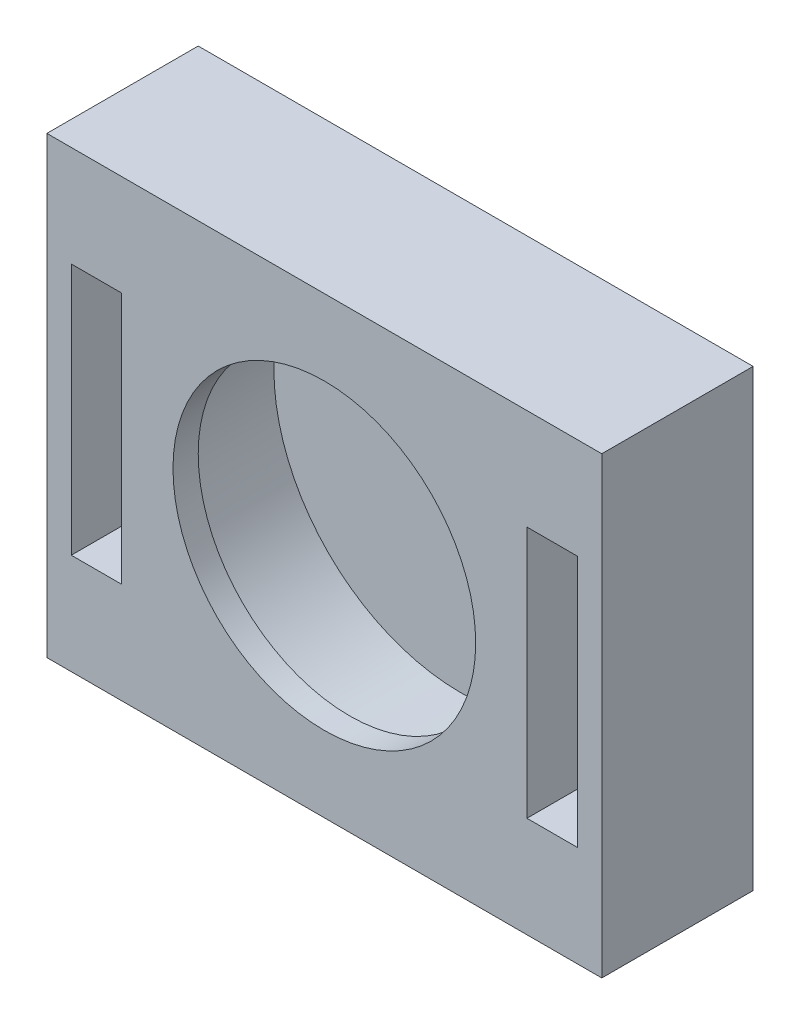
ISO-10303-21;
HEADER;
FILE_DESCRIPTION(('STEP AP214'),'2;1');
FILE_NAME('part.step','',(''),(''),'','','');
FILE_SCHEMA(('AUTOMOTIVE_DESIGN { 1 0 10303 214 1 1 1 1 }'));
ENDSEC;
DATA;
#1=APPLICATION_CONTEXT('core data for automotive mechanical design processes');
#2=APPLICATION_PROTOCOL_DEFINITION('international standard','automotive_design',2000,#1);
#3=PRODUCT_CONTEXT('',#1,'mechanical');
#4=PRODUCT('Part','Part','',(#3));
#5=PRODUCT_RELATED_PRODUCT_CATEGORY('part','',(#4));
#6=PRODUCT_DEFINITION_FORMATION('','',#4);
#7=PRODUCT_DEFINITION_CONTEXT('part definition',#1,'design');
#8=PRODUCT_DEFINITION('design','',#6,#7);
#9=PRODUCT_DEFINITION_SHAPE('','',#8);
#10=(LENGTH_UNIT() NAMED_UNIT(*) SI_UNIT(.MILLI.,.METRE.));
#11=(NAMED_UNIT(*) PLANE_ANGLE_UNIT() SI_UNIT($,.RADIAN.));
#12=(NAMED_UNIT(*) SI_UNIT($,.STERADIAN.) SOLID_ANGLE_UNIT());
#13=UNCERTAINTY_MEASURE_WITH_UNIT(LENGTH_MEASURE(1.E-05),#10,'distance_accuracy_value','');
#14=(GEOMETRIC_REPRESENTATION_CONTEXT(3) GLOBAL_UNCERTAINTY_ASSIGNED_CONTEXT((#13)) GLOBAL_UNIT_ASSIGNED_CONTEXT((#10,
#11,#12)) REPRESENTATION_CONTEXT('',''));
#15=CARTESIAN_POINT('',(0.,0.,0.));
#16=DIRECTION('',(0.,0.,1.));
#17=DIRECTION('',(1.,0.,0.));
#18=AXIS2_PLACEMENT_3D('',#15,#16,#17);
#19=CARTESIAN_POINT('',(13.97,-11.43,6.35));
#20=DIRECTION('',(-1.,0.,0.));
#21=DIRECTION('',(0.,0.,1.));
#22=AXIS2_PLACEMENT_3D('',#19,#20,#21);
#23=PLANE('',#22);
#24=DIRECTION('',(0.,1.,0.));
#25=VECTOR('',#24,1.);
#26=CARTESIAN_POINT('',(13.97,-11.43,0.));
#27=LINE('',#26,#25);
#28=CARTESIAN_POINT('',(13.97,-11.43,0.));
#29=VERTEX_POINT('',#28);
#30=CARTESIAN_POINT('',(13.97,11.43,0.));
#31=VERTEX_POINT('',#30);
#32=EDGE_CURVE('E211',#29,#31,#27,.T.);
#33=ORIENTED_EDGE('',*,*,#32,.T.);
#34=DIRECTION('',(0.,0.,-1.));
#35=VECTOR('',#34,1.);
#36=CARTESIAN_POINT('',(13.97,11.43,6.35));
#37=LINE('',#36,#35);
#38=CARTESIAN_POINT('',(13.97,11.43,7.62));
#39=VERTEX_POINT('',#38);
#40=EDGE_CURVE('E11',#39,#31,#37,.T.);
#41=ORIENTED_EDGE('',*,*,#40,.F.);
#42=DIRECTION('',(0.,1.,0.));
#43=VECTOR('',#42,1.);
#44=CARTESIAN_POINT('',(13.97,11.43,7.62));
#45=LINE('',#44,#43);
#46=CARTESIAN_POINT('',(13.97,-11.43,7.62));
#47=VERTEX_POINT('',#46);
#48=EDGE_CURVE('E201',#47,#39,#45,.T.);
#49=ORIENTED_EDGE('',*,*,#48,.F.);
#50=DIRECTION('',(0.,0.,-1.));
#51=VECTOR('',#50,1.);
#52=CARTESIAN_POINT('',(13.97,-11.43,6.35));
#53=LINE('',#52,#51);
#54=EDGE_CURVE('E222',#47,#29,#53,.T.);
#55=ORIENTED_EDGE('',*,*,#54,.T.);
#56=EDGE_LOOP('',(#33,#41,#49,#55));
#57=FACE_BOUND('',#56,.T.);
#58=ADVANCED_FACE('F33',(#57),#23,.F.);
#59=CARTESIAN_POINT('',(-13.97,11.43,6.35));
#60=DIRECTION('',(0.,-1.,0.));
#61=DIRECTION('',(0.,0.,-1.));
#62=AXIS2_PLACEMENT_3D('',#59,#60,#61);
#63=PLANE('',#62);
#64=DIRECTION('',(-1.,0.,0.));
#65=VECTOR('',#64,1.);
#66=CARTESIAN_POINT('',(-13.97,11.43,0.));
#67=LINE('',#66,#65);
#68=CARTESIAN_POINT('',(-13.97,11.43,0.));
#69=VERTEX_POINT('',#68);
#70=EDGE_CURVE('E216',#31,#69,#67,.T.);
#71=ORIENTED_EDGE('',*,*,#70,.T.);
#72=DIRECTION('',(0.,0.,-1.));
#73=VECTOR('',#72,1.);
#74=CARTESIAN_POINT('',(-13.97,11.43,6.35));
#75=LINE('',#74,#73);
#76=CARTESIAN_POINT('',(-13.97,11.43,7.62));
#77=VERTEX_POINT('',#76);
#78=EDGE_CURVE('E40',#77,#69,#75,.T.);
#79=ORIENTED_EDGE('',*,*,#78,.F.);
#80=DIRECTION('',(-1.,0.,0.));
#81=VECTOR('',#80,1.);
#82=CARTESIAN_POINT('',(-13.97,11.43,7.62));
#83=LINE('',#82,#81);
#84=EDGE_CURVE('E204',#39,#77,#83,.T.);
#85=ORIENTED_EDGE('',*,*,#84,.F.);
#86=ORIENTED_EDGE('',*,*,#40,.T.);
#87=EDGE_LOOP('',(#71,#79,#85,#86));
#88=FACE_BOUND('',#87,.T.);
#89=ADVANCED_FACE('F245',(#88),#63,.F.);
#90=CARTESIAN_POINT('',(-13.97,-11.43,6.35));
#91=DIRECTION('',(1.,0.,0.));
#92=DIRECTION('',(0.,0.,-1.));
#93=AXIS2_PLACEMENT_3D('',#90,#91,#92);
#94=PLANE('',#93);
#95=DIRECTION('',(0.,-1.,0.));
#96=VECTOR('',#95,1.);
#97=CARTESIAN_POINT('',(-13.97,-11.43,0.));
#98=LINE('',#97,#96);
#99=CARTESIAN_POINT('',(-13.97,-11.43,0.));
#100=VERTEX_POINT('',#99);
#101=EDGE_CURVE('E218',#69,#100,#98,.T.);
#102=ORIENTED_EDGE('',*,*,#101,.T.);
#103=DIRECTION('',(0.,0.,-1.));
#104=VECTOR('',#103,1.);
#105=CARTESIAN_POINT('',(-13.97,-11.43,6.35));
#106=LINE('',#105,#104);
#107=CARTESIAN_POINT('',(-13.97,-11.43,7.62));
#108=VERTEX_POINT('',#107);
#109=EDGE_CURVE('E225',#108,#100,#106,.T.);
#110=ORIENTED_EDGE('',*,*,#109,.F.);
#111=DIRECTION('',(0.,-1.,0.));
#112=VECTOR('',#111,1.);
#113=CARTESIAN_POINT('',(-13.97,11.43,7.62));
#114=LINE('',#113,#112);
#115=EDGE_CURVE('E193',#77,#108,#114,.T.);
#116=ORIENTED_EDGE('',*,*,#115,.F.);
#117=ORIENTED_EDGE('',*,*,#78,.T.);
#118=EDGE_LOOP('',(#102,#110,#116,#117));
#119=FACE_BOUND('',#118,.T.);
#120=ADVANCED_FACE('F231',(#119),#94,.F.);
#121=CARTESIAN_POINT('',(-13.97,-11.43,6.35));
#122=DIRECTION('',(0.,1.,0.));
#123=DIRECTION('',(0.,0.,1.));
#124=AXIS2_PLACEMENT_3D('',#121,#122,#123);
#125=PLANE('',#124);
#126=DIRECTION('',(1.,0.,0.));
#127=VECTOR('',#126,1.);
#128=CARTESIAN_POINT('',(-13.97,-11.43,0.));
#129=LINE('',#128,#127);
#130=EDGE_CURVE('E220',#100,#29,#129,.T.);
#131=ORIENTED_EDGE('',*,*,#130,.T.);
#132=ORIENTED_EDGE('',*,*,#54,.F.);
#133=DIRECTION('',(1.,0.,0.));
#134=VECTOR('',#133,1.);
#135=CARTESIAN_POINT('',(-13.97,-11.43,7.62));
#136=LINE('',#135,#134);
#137=EDGE_CURVE('E198',#108,#47,#136,.T.);
#138=ORIENTED_EDGE('',*,*,#137,.F.);
#139=ORIENTED_EDGE('',*,*,#109,.T.);
#140=EDGE_LOOP('',(#131,#132,#138,#139));
#141=FACE_BOUND('',#140,.T.);
#142=ADVANCED_FACE('F238',(#141),#125,.F.);
#143=CARTESIAN_POINT('',(0.,0.,0.));
#144=DIRECTION('',(0.,0.,-1.));
#145=DIRECTION('',(-1.,0.,0.));
#146=AXIS2_PLACEMENT_3D('',#143,#144,#145);
#147=PLANE('',#146);
#148=DIRECTION('',(1.,0.,0.));
#149=VECTOR('',#148,1.);
#150=CARTESIAN_POINT('',(12.7406692898048,-6.35,0.));
#151=LINE('',#150,#149);
#152=CARTESIAN_POINT('',(10.2006692898048,-6.35,0.));
#153=VERTEX_POINT('',#152);
#154=CARTESIAN_POINT('',(12.7406692898048,-6.35,0.));
#155=VERTEX_POINT('',#154);
#156=EDGE_CURVE('E134',#153,#155,#151,.T.);
#157=ORIENTED_EDGE('',*,*,#156,.T.);
#158=DIRECTION('',(0.,1.,0.));
#159=VECTOR('',#158,1.);
#160=CARTESIAN_POINT('',(12.7406692898048,-6.35,0.));
#161=LINE('',#160,#159);
#162=CARTESIAN_POINT('',(12.7406692898048,6.34999999999999,0.));
#163=VERTEX_POINT('',#162);
#164=EDGE_CURVE('E121',#155,#163,#161,.T.);
#165=ORIENTED_EDGE('',*,*,#164,.T.);
#166=DIRECTION('',(-1.,0.,0.));
#167=VECTOR('',#166,1.);
#168=CARTESIAN_POINT('',(12.7406692898048,6.34999999999999,0.));
#169=LINE('',#168,#167);
#170=CARTESIAN_POINT('',(10.2006692898048,6.34999999999999,0.));
#171=VERTEX_POINT('',#170);
#172=EDGE_CURVE('E153',#163,#171,#169,.T.);
#173=ORIENTED_EDGE('',*,*,#172,.T.);
#174=DIRECTION('',(0.,-1.,0.));
#175=VECTOR('',#174,1.);
#176=CARTESIAN_POINT('',(10.2006692898048,-6.35,0.));
#177=LINE('',#176,#175);
#178=EDGE_CURVE('E142',#171,#153,#177,.T.);
#179=ORIENTED_EDGE('',*,*,#178,.T.);
#180=EDGE_LOOP('',(#157,#165,#173,#179));
#181=FACE_BOUND('',#180,.T.);
#182=DIRECTION('',(1.,0.,0.));
#183=VECTOR('',#182,1.);
#184=CARTESIAN_POINT('',(-12.7406692898048,-6.35,0.));
#185=LINE('',#184,#183);
#186=CARTESIAN_POINT('',(-12.7406692898048,-6.35,0.));
#187=VERTEX_POINT('',#186);
#188=CARTESIAN_POINT('',(-10.2006692898048,-6.35,0.));
#189=VERTEX_POINT('',#188);
#190=EDGE_CURVE('E162',#187,#189,#185,.T.);
#191=ORIENTED_EDGE('',*,*,#190,.T.);
#192=DIRECTION('',(0.,1.,0.));
#193=VECTOR('',#192,1.);
#194=CARTESIAN_POINT('',(-10.2006692898048,-6.35,0.));
#195=LINE('',#194,#193);
#196=CARTESIAN_POINT('',(-10.2006692898049,6.34999999999999,0.));
#197=VERTEX_POINT('',#196);
#198=EDGE_CURVE('E182',#189,#197,#195,.T.);
#199=ORIENTED_EDGE('',*,*,#198,.T.);
#200=DIRECTION('',(-1.,0.,0.));
#201=VECTOR('',#200,1.);
#202=CARTESIAN_POINT('',(-12.7406692898049,6.34999999999999,0.));
#203=LINE('',#202,#201);
#204=CARTESIAN_POINT('',(-12.7406692898049,6.34999999999999,0.));
#205=VERTEX_POINT('',#204);
#206=EDGE_CURVE('E178',#197,#205,#203,.T.);
#207=ORIENTED_EDGE('',*,*,#206,.T.);
#208=DIRECTION('',(0.,-1.,0.));
#209=VECTOR('',#208,1.);
#210=CARTESIAN_POINT('',(-12.7406692898048,-6.35,0.));
#211=LINE('',#210,#209);
#212=EDGE_CURVE('E174',#205,#187,#211,.T.);
#213=ORIENTED_EDGE('',*,*,#212,.T.);
#214=EDGE_LOOP('',(#191,#199,#207,#213));
#215=FACE_BOUND('',#214,.T.);
#216=ORIENTED_EDGE('',*,*,#32,.F.);
#217=ORIENTED_EDGE('',*,*,#130,.F.);
#218=ORIENTED_EDGE('',*,*,#101,.F.);
#219=ORIENTED_EDGE('',*,*,#70,.F.);
#220=EDGE_LOOP('',(#216,#217,#218,#219));
#221=FACE_BOUND('',#220,.T.);
#222=ADVANCED_FACE('F140',(#181,#215,#221),#147,.T.);
#223=CARTESIAN_POINT('',(0.,0.,6.35));
#224=DIRECTION('',(0.,0.,1.));
#225=DIRECTION('',(1.,0.,0.));
#226=AXIS2_PLACEMENT_3D('',#223,#224,#225);
#227=PLANE('',#226);
#228=CARTESIAN_POINT('',(0.,0.,6.35));
#229=DIRECTION('',(0.,0.,1.));
#230=DIRECTION('',(1.,0.,0.));
#231=AXIS2_PLACEMENT_3D('',#228,#229,#230);
#232=CIRCLE('',#231,7.62);
#233=CARTESIAN_POINT('',(7.62,0.,6.35));
#234=VERTEX_POINT('',#233);
#235=EDGE_CURVE('E159',#234,#234,#232,.T.);
#236=ORIENTED_EDGE('',*,*,#235,.T.);
#237=EDGE_LOOP('',(#236));
#238=FACE_BOUND('',#237,.T.);
#239=CARTESIAN_POINT('',(0.,0.,6.35));
#240=DIRECTION('',(0.,0.,1.));
#241=DIRECTION('',(1.,0.,0.));
#242=AXIS2_PLACEMENT_3D('',#239,#240,#241);
#243=CIRCLE('',#242,9.398);
#244=CARTESIAN_POINT('',(9.398,0.,6.35));
#245=VERTEX_POINT('',#244);
#246=EDGE_CURVE('E207',#245,#245,#243,.T.);
#247=ORIENTED_EDGE('',*,*,#246,.F.);
#248=EDGE_LOOP('',(#247));
#249=FACE_BOUND('',#248,.T.);
#250=ADVANCED_FACE('F257',(#238,#249),#227,.F.);
#251=CARTESIAN_POINT('',(0.,0.,7.62));
#252=DIRECTION('',(0.,0.,1.));
#253=DIRECTION('',(1.,0.,0.));
#254=AXIS2_PLACEMENT_3D('',#251,#252,#253);
#255=PLANE('',#254);
#256=DIRECTION('',(1.,0.,0.));
#257=VECTOR('',#256,1.);
#258=CARTESIAN_POINT('',(12.7406692898048,-6.35,7.62));
#259=LINE('',#258,#257);
#260=CARTESIAN_POINT('',(10.2006692898048,-6.35,7.62));
#261=VERTEX_POINT('',#260);
#262=CARTESIAN_POINT('',(12.7406692898048,-6.35,7.62));
#263=VERTEX_POINT('',#262);
#264=EDGE_CURVE('E137',#261,#263,#259,.T.);
#265=ORIENTED_EDGE('',*,*,#264,.F.);
#266=DIRECTION('',(0.,-1.,0.));
#267=VECTOR('',#266,1.);
#268=CARTESIAN_POINT('',(10.2006692898048,-6.35,7.62));
#269=LINE('',#268,#267);
#270=CARTESIAN_POINT('',(10.2006692898048,6.34999999999999,7.62));
#271=VERTEX_POINT('',#270);
#272=EDGE_CURVE('E149',#271,#261,#269,.T.);
#273=ORIENTED_EDGE('',*,*,#272,.F.);
#274=DIRECTION('',(-1.,0.,0.));
#275=VECTOR('',#274,1.);
#276=CARTESIAN_POINT('',(12.7406692898048,6.34999999999999,7.62));
#277=LINE('',#276,#275);
#278=CARTESIAN_POINT('',(12.7406692898048,6.34999999999999,7.62));
#279=VERTEX_POINT('',#278);
#280=EDGE_CURVE('E143',#279,#271,#277,.T.);
#281=ORIENTED_EDGE('',*,*,#280,.F.);
#282=DIRECTION('',(0.,1.,0.));
#283=VECTOR('',#282,1.);
#284=CARTESIAN_POINT('',(12.7406692898048,-6.35,7.62));
#285=LINE('',#284,#283);
#286=EDGE_CURVE('E145',#263,#279,#285,.T.);
#287=ORIENTED_EDGE('',*,*,#286,.F.);
#288=EDGE_LOOP('',(#265,#273,#281,#287));
#289=FACE_BOUND('',#288,.T.);
#290=DIRECTION('',(1.,0.,0.));
#291=VECTOR('',#290,1.);
#292=CARTESIAN_POINT('',(-12.7406692898048,-6.35,7.62));
#293=LINE('',#292,#291);
#294=CARTESIAN_POINT('',(-12.7406692898048,-6.35,7.62));
#295=VERTEX_POINT('',#294);
#296=CARTESIAN_POINT('',(-10.2006692898048,-6.35,7.62));
#297=VERTEX_POINT('',#296);
#298=EDGE_CURVE('E166',#295,#297,#293,.T.);
#299=ORIENTED_EDGE('',*,*,#298,.F.);
#300=DIRECTION('',(0.,-1.,0.));
#301=VECTOR('',#300,1.);
#302=CARTESIAN_POINT('',(-12.7406692898048,-6.35,7.62));
#303=LINE('',#302,#301);
#304=CARTESIAN_POINT('',(-12.7406692898049,6.34999999999999,7.62));
#305=VERTEX_POINT('',#304);
#306=EDGE_CURVE('E169',#305,#295,#303,.T.);
#307=ORIENTED_EDGE('',*,*,#306,.F.);
#308=DIRECTION('',(-1.,0.,0.));
#309=VECTOR('',#308,1.);
#310=CARTESIAN_POINT('',(-12.7406692898049,6.34999999999999,7.62));
#311=LINE('',#310,#309);
#312=CARTESIAN_POINT('',(-10.2006692898049,6.34999999999999,7.62));
#313=VERTEX_POINT('',#312);
#314=EDGE_CURVE('E160',#313,#305,#311,.T.);
#315=ORIENTED_EDGE('',*,*,#314,.F.);
#316=DIRECTION('',(0.,1.,0.));
#317=VECTOR('',#316,1.);
#318=CARTESIAN_POINT('',(-10.2006692898048,-6.35,7.62));
#319=LINE('',#318,#317);
#320=EDGE_CURVE('E163',#297,#313,#319,.T.);
#321=ORIENTED_EDGE('',*,*,#320,.F.);
#322=EDGE_LOOP('',(#299,#307,#315,#321));
#323=FACE_BOUND('',#322,.T.);
#324=ORIENTED_EDGE('',*,*,#115,.T.);
#325=ORIENTED_EDGE('',*,*,#137,.T.);
#326=ORIENTED_EDGE('',*,*,#48,.T.);
#327=ORIENTED_EDGE('',*,*,#84,.T.);
#328=EDGE_LOOP('',(#324,#325,#326,#327));
#329=FACE_BOUND('',#328,.T.);
#330=CARTESIAN_POINT('',(0.,0.,7.62));
#331=DIRECTION('',(0.,0.,1.));
#332=DIRECTION('',(1.,0.,0.));
#333=AXIS2_PLACEMENT_3D('',#330,#331,#332);
#334=CIRCLE('',#333,7.62);
#335=CARTESIAN_POINT('',(7.62,0.,7.62));
#336=VERTEX_POINT('',#335);
#337=EDGE_CURVE('E190',#336,#336,#334,.T.);
#338=ORIENTED_EDGE('',*,*,#337,.F.);
#339=EDGE_LOOP('',(#338));
#340=FACE_BOUND('',#339,.T.);
#341=ADVANCED_FACE('F243',(#289,#323,#329,#340),#255,.T.);
#342=CARTESIAN_POINT('',(0.,0.,7.62));
#343=DIRECTION('',(0.,0.,-1.));
#344=DIRECTION('',(-1.,0.,0.));
#345=AXIS2_PLACEMENT_3D('',#342,#343,#344);
#346=CYLINDRICAL_SURFACE('',#345,7.62);
#347=ORIENTED_EDGE('',*,*,#337,.T.);
#348=EDGE_LOOP('',(#347));
#349=FACE_BOUND('',#348,.T.);
#350=ORIENTED_EDGE('',*,*,#235,.F.);
#351=EDGE_LOOP('',(#350));
#352=FACE_BOUND('',#351,.T.);
#353=ADVANCED_FACE('F266',(#349,#352),#346,.F.);
#354=CARTESIAN_POINT('',(0.,0.,0.762));
#355=DIRECTION('',(0.,0.,1.));
#356=DIRECTION('',(1.,0.,0.));
#357=AXIS2_PLACEMENT_3D('',#354,#355,#356);
#358=PLANE('',#357);
#359=CARTESIAN_POINT('',(0.,0.,0.762));
#360=DIRECTION('',(0.,0.,1.));
#361=DIRECTION('',(1.,0.,0.));
#362=AXIS2_PLACEMENT_3D('',#359,#360,#361);
#363=CIRCLE('',#362,9.398);
#364=CARTESIAN_POINT('',(9.398,0.,0.762));
#365=VERTEX_POINT('',#364);
#366=EDGE_CURVE('E208',#365,#365,#363,.T.);
#367=ORIENTED_EDGE('',*,*,#366,.T.);
#368=EDGE_LOOP('',(#367));
#369=FACE_BOUND('',#368,.T.);
#370=ADVANCED_FACE('F262',(#369),#358,.T.);
#371=CARTESIAN_POINT('',(0.,0.,0.762));
#372=DIRECTION('',(0.,0.,1.));
#373=DIRECTION('',(1.,0.,0.));
#374=AXIS2_PLACEMENT_3D('',#371,#372,#373);
#375=CYLINDRICAL_SURFACE('',#374,9.398);
#376=ORIENTED_EDGE('',*,*,#366,.F.);
#377=EDGE_LOOP('',(#376));
#378=FACE_BOUND('',#377,.T.);
#379=ORIENTED_EDGE('',*,*,#246,.T.);
#380=EDGE_LOOP('',(#379));
#381=FACE_BOUND('',#380,.T.);
#382=ADVANCED_FACE('F258',(#378,#381),#375,.F.);
#383=CARTESIAN_POINT('',(-12.7406692898048,-6.35,-12.9515095645257));
#384=DIRECTION('',(0.,-1.,0.));
#385=DIRECTION('',(0.,0.,-1.));
#386=AXIS2_PLACEMENT_3D('',#383,#384,#385);
#387=PLANE('',#386);
#388=DIRECTION('',(0.,0.,1.));
#389=VECTOR('',#388,1.);
#390=CARTESIAN_POINT('',(-12.7406692898048,-6.35,-12.9515095645257));
#391=LINE('',#390,#389);
#392=EDGE_CURVE('E55',#187,#295,#391,.T.);
#393=ORIENTED_EDGE('',*,*,#392,.T.);
#394=ORIENTED_EDGE('',*,*,#298,.T.);
#395=DIRECTION('',(0.,0.,1.));
#396=VECTOR('',#395,1.);
#397=CARTESIAN_POINT('',(-10.2006692898048,-6.35,-12.9515095645257));
#398=LINE('',#397,#396);
#399=EDGE_CURVE('E173',#189,#297,#398,.T.);
#400=ORIENTED_EDGE('',*,*,#399,.F.);
#401=ORIENTED_EDGE('',*,*,#190,.F.);
#402=EDGE_LOOP('',(#393,#394,#400,#401));
#403=FACE_BOUND('',#402,.T.);
#404=ADVANCED_FACE('F261',(#403),#387,.F.);
#405=CARTESIAN_POINT('',(-10.2006692898048,-6.35,-12.9515095645257));
#406=DIRECTION('',(1.,0.,0.));
#407=DIRECTION('',(0.,1.,0.));
#408=AXIS2_PLACEMENT_3D('',#405,#406,#407);
#409=PLANE('',#408);
#410=ORIENTED_EDGE('',*,*,#399,.T.);
#411=ORIENTED_EDGE('',*,*,#320,.T.);
#412=DIRECTION('',(0.,0.,1.));
#413=VECTOR('',#412,1.);
#414=CARTESIAN_POINT('',(-10.2006692898049,6.34999999999999,-12.9515095645257));
#415=LINE('',#414,#413);
#416=EDGE_CURVE('E181',#197,#313,#415,.T.);
#417=ORIENTED_EDGE('',*,*,#416,.F.);
#418=ORIENTED_EDGE('',*,*,#198,.F.);
#419=EDGE_LOOP('',(#410,#411,#417,#418));
#420=FACE_BOUND('',#419,.T.);
#421=ADVANCED_FACE('F279',(#420),#409,.F.);
#422=CARTESIAN_POINT('',(-12.7406692898049,6.34999999999999,-12.9515095645257));
#423=DIRECTION('',(0.,1.,0.));
#424=DIRECTION('',(-1.,0.,0.));
#425=AXIS2_PLACEMENT_3D('',#422,#423,#424);
#426=PLANE('',#425);
#427=ORIENTED_EDGE('',*,*,#416,.T.);
#428=ORIENTED_EDGE('',*,*,#314,.T.);
#429=DIRECTION('',(0.,0.,1.));
#430=VECTOR('',#429,1.);
#431=CARTESIAN_POINT('',(-12.7406692898049,6.34999999999999,-12.9515095645257));
#432=LINE('',#431,#430);
#433=EDGE_CURVE('E177',#205,#305,#432,.T.);
#434=ORIENTED_EDGE('',*,*,#433,.F.);
#435=ORIENTED_EDGE('',*,*,#206,.F.);
#436=EDGE_LOOP('',(#427,#428,#434,#435));
#437=FACE_BOUND('',#436,.T.);
#438=ADVANCED_FACE('F283',(#437),#426,.F.);
#439=CARTESIAN_POINT('',(-12.7406692898048,-6.35,-12.9515095645257));
#440=DIRECTION('',(-1.,0.,0.));
#441=DIRECTION('',(0.,-1.,0.));
#442=AXIS2_PLACEMENT_3D('',#439,#440,#441);
#443=PLANE('',#442);
#444=ORIENTED_EDGE('',*,*,#433,.T.);
#445=ORIENTED_EDGE('',*,*,#306,.T.);
#446=ORIENTED_EDGE('',*,*,#392,.F.);
#447=ORIENTED_EDGE('',*,*,#212,.F.);
#448=EDGE_LOOP('',(#444,#445,#446,#447));
#449=FACE_BOUND('',#448,.T.);
#450=ADVANCED_FACE('F287',(#449),#443,.F.);
#451=CARTESIAN_POINT('',(12.7406692898048,-6.35,-12.9515095645257));
#452=DIRECTION('',(0.,-1.,0.));
#453=DIRECTION('',(0.,0.,-1.));
#454=AXIS2_PLACEMENT_3D('',#451,#452,#453);
#455=PLANE('',#454);
#456=DIRECTION('',(0.,0.,1.));
#457=VECTOR('',#456,1.);
#458=CARTESIAN_POINT('',(10.2006692898048,-6.35,-12.9515095645257));
#459=LINE('',#458,#457);
#460=EDGE_CURVE('E47',#153,#261,#459,.T.);
#461=ORIENTED_EDGE('',*,*,#460,.T.);
#462=ORIENTED_EDGE('',*,*,#264,.T.);
#463=DIRECTION('',(0.,0.,1.));
#464=VECTOR('',#463,1.);
#465=CARTESIAN_POINT('',(12.7406692898048,-6.35,-12.9515095645257));
#466=LINE('',#465,#464);
#467=EDGE_CURVE('E125',#155,#263,#466,.T.);
#468=ORIENTED_EDGE('',*,*,#467,.F.);
#469=ORIENTED_EDGE('',*,*,#156,.F.);
#470=EDGE_LOOP('',(#461,#462,#468,#469));
#471=FACE_BOUND('',#470,.T.);
#472=ADVANCED_FACE('F133',(#471),#455,.F.);
#473=CARTESIAN_POINT('',(12.7406692898048,-6.35,-12.9515095645257));
#474=DIRECTION('',(1.,0.,0.));
#475=DIRECTION('',(0.,0.,-1.));
#476=AXIS2_PLACEMENT_3D('',#473,#474,#475);
#477=PLANE('',#476);
#478=ORIENTED_EDGE('',*,*,#467,.T.);
#479=ORIENTED_EDGE('',*,*,#286,.T.);
#480=DIRECTION('',(0.,0.,1.));
#481=VECTOR('',#480,1.);
#482=CARTESIAN_POINT('',(12.7406692898048,6.34999999999999,-12.9515095645257));
#483=LINE('',#482,#481);
#484=EDGE_CURVE('E127',#163,#279,#483,.T.);
#485=ORIENTED_EDGE('',*,*,#484,.F.);
#486=ORIENTED_EDGE('',*,*,#164,.F.);
#487=EDGE_LOOP('',(#478,#479,#485,#486));
#488=FACE_BOUND('',#487,.T.);
#489=ADVANCED_FACE('F123',(#488),#477,.F.);
#490=CARTESIAN_POINT('',(12.7406692898048,6.34999999999999,-12.9515095645257));
#491=DIRECTION('',(0.,1.,0.));
#492=DIRECTION('',(-1.,0.,0.));
#493=AXIS2_PLACEMENT_3D('',#490,#491,#492);
#494=PLANE('',#493);
#495=ORIENTED_EDGE('',*,*,#484,.T.);
#496=ORIENTED_EDGE('',*,*,#280,.T.);
#497=DIRECTION('',(0.,0.,1.));
#498=VECTOR('',#497,1.);
#499=CARTESIAN_POINT('',(10.2006692898048,6.34999999999999,-12.9515095645257));
#500=LINE('',#499,#498);
#501=EDGE_CURVE('E152',#171,#271,#500,.T.);
#502=ORIENTED_EDGE('',*,*,#501,.F.);
#503=ORIENTED_EDGE('',*,*,#172,.F.);
#504=EDGE_LOOP('',(#495,#496,#502,#503));
#505=FACE_BOUND('',#504,.T.);
#506=ADVANCED_FACE('F295',(#505),#494,.F.);
#507=CARTESIAN_POINT('',(10.2006692898048,-6.35,-12.9515095645257));
#508=DIRECTION('',(-1.,0.,0.));
#509=DIRECTION('',(0.,0.,1.));
#510=AXIS2_PLACEMENT_3D('',#507,#508,#509);
#511=PLANE('',#510);
#512=ORIENTED_EDGE('',*,*,#501,.T.);
#513=ORIENTED_EDGE('',*,*,#272,.T.);
#514=ORIENTED_EDGE('',*,*,#460,.F.);
#515=ORIENTED_EDGE('',*,*,#178,.F.);
#516=EDGE_LOOP('',(#512,#513,#514,#515));
#517=FACE_BOUND('',#516,.T.);
#518=ADVANCED_FACE('F298',(#517),#511,.F.);
#519=CLOSED_SHELL('',(#58,#89,#120,#142,#222,#250,#341,#353,#370,#382,#404,#421,#438,#450,#472,
#489,#506,#518));
#520=MANIFOLD_SOLID_BREP('B2',#519);
#521=ADVANCED_BREP_SHAPE_REPRESENTATION('',(#18,#520),#14);
#522=SHAPE_DEFINITION_REPRESENTATION(#9,#521);
ENDSEC;
END-ISO-10303-21;
